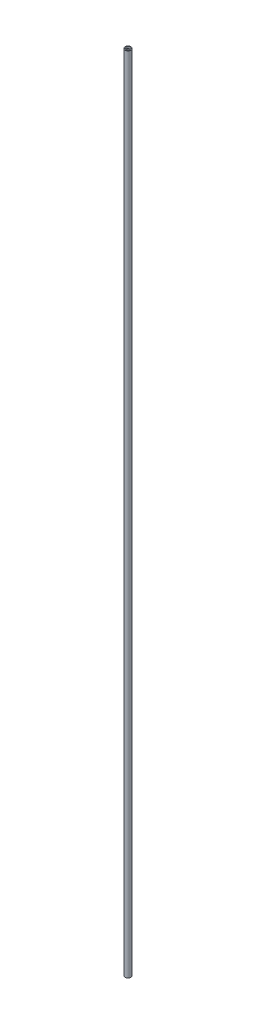
ISO-10303-21;
HEADER;
FILE_DESCRIPTION(('STEP AP214'),'2;1');
FILE_NAME('part.step','',(''),(''),'','','');
FILE_SCHEMA(('AUTOMOTIVE_DESIGN { 1 0 10303 214 1 1 1 1 }'));
ENDSEC;
DATA;
#1=APPLICATION_CONTEXT('core data for automotive mechanical design processes');
#2=APPLICATION_PROTOCOL_DEFINITION('international standard','automotive_design',2000,#1);
#3=PRODUCT_CONTEXT('',#1,'mechanical');
#4=PRODUCT('Part','Part','',(#3));
#5=PRODUCT_RELATED_PRODUCT_CATEGORY('part','',(#4));
#6=PRODUCT_DEFINITION_FORMATION('','',#4);
#7=PRODUCT_DEFINITION_CONTEXT('part definition',#1,'design');
#8=PRODUCT_DEFINITION('design','',#6,#7);
#9=PRODUCT_DEFINITION_SHAPE('','',#8);
#10=(LENGTH_UNIT() NAMED_UNIT(*) SI_UNIT(.MILLI.,.METRE.));
#11=(NAMED_UNIT(*) PLANE_ANGLE_UNIT() SI_UNIT($,.RADIAN.));
#12=(NAMED_UNIT(*) SI_UNIT($,.STERADIAN.) SOLID_ANGLE_UNIT());
#13=UNCERTAINTY_MEASURE_WITH_UNIT(LENGTH_MEASURE(1.E-05),#10,'distance_accuracy_value','');
#14=(GEOMETRIC_REPRESENTATION_CONTEXT(3) GLOBAL_UNCERTAINTY_ASSIGNED_CONTEXT((#13)) GLOBAL_UNIT_ASSIGNED_CONTEXT((#10,
#11,#12)) REPRESENTATION_CONTEXT('',''));
#15=CARTESIAN_POINT('',(0.,0.,0.));
#16=DIRECTION('',(0.,0.,1.));
#17=DIRECTION('',(1.,0.,0.));
#18=AXIS2_PLACEMENT_3D('',#15,#16,#17);
#19=CARTESIAN_POINT('',(0.,855.,0.));
#20=DIRECTION('',(0.,1.,0.));
#21=DIRECTION('',(0.,0.,1.));
#22=AXIS2_PLACEMENT_3D('',#19,#20,#21);
#23=PLANE('',#22);
#24=CARTESIAN_POINT('',(0.,855.,0.));
#25=DIRECTION('',(0.,1.,0.));
#26=DIRECTION('',(0.,0.,1.));
#27=AXIS2_PLACEMENT_3D('',#24,#25,#26);
#28=CIRCLE('',#27,2.16235026918937);
#29=CARTESIAN_POINT('',(0.,855.,2.16235026918937));
#30=VERTEX_POINT('',#29);
#31=EDGE_CURVE('E39',#30,#30,#28,.F.);
#32=ORIENTED_EDGE('',*,*,#31,.T.);
#33=EDGE_LOOP('',(#32));
#34=FACE_BOUND('',#33,.T.);
#35=CARTESIAN_POINT('',(0.,855.,0.));
#36=DIRECTION('',(0.,1.,0.));
#37=DIRECTION('',(0.,0.,1.));
#38=AXIS2_PLACEMENT_3D('',#35,#36,#37);
#39=CIRCLE('',#38,3.175);
#40=CARTESIAN_POINT('',(0.,855.,-3.175));
#41=VERTEX_POINT('',#40);
#42=EDGE_CURVE('E52',#41,#41,#39,.T.);
#43=ORIENTED_EDGE('',*,*,#42,.T.);
#44=EDGE_LOOP('',(#43));
#45=FACE_BOUND('',#44,.T.);
#46=ADVANCED_FACE('F32',(#34,#45),#23,.T.);
#47=CARTESIAN_POINT('',(0.,0.,0.));
#48=DIRECTION('',(0.,1.,0.));
#49=DIRECTION('',(0.,0.,1.));
#50=AXIS2_PLACEMENT_3D('',#47,#48,#49);
#51=PLANE('',#50);
#52=CARTESIAN_POINT('',(0.,0.,0.));
#53=DIRECTION('',(0.,1.,0.));
#54=DIRECTION('',(0.,0.,1.));
#55=AXIS2_PLACEMENT_3D('',#52,#53,#54);
#56=CIRCLE('',#55,2.16235026918954);
#57=CARTESIAN_POINT('',(0.,0.,2.16235026918954));
#58=VERTEX_POINT('',#57);
#59=EDGE_CURVE('E10',#58,#58,#56,.T.);
#60=ORIENTED_EDGE('',*,*,#59,.T.);
#61=EDGE_LOOP('',(#60));
#62=FACE_BOUND('',#61,.T.);
#63=CARTESIAN_POINT('',(0.,0.,0.));
#64=DIRECTION('',(0.,1.,0.));
#65=DIRECTION('',(0.,0.,1.));
#66=AXIS2_PLACEMENT_3D('',#63,#64,#65);
#67=CIRCLE('',#66,3.175);
#68=CARTESIAN_POINT('',(0.,-1.11022302462516E-13,-3.175));
#69=VERTEX_POINT('',#68);
#70=EDGE_CURVE('E53',#69,#69,#67,.T.);
#71=ORIENTED_EDGE('',*,*,#70,.F.);
#72=EDGE_LOOP('',(#71));
#73=FACE_BOUND('',#72,.T.);
#74=ADVANCED_FACE('F64',(#62,#73),#51,.F.);
#75=CARTESIAN_POINT('',(0.,855.,0.));
#76=DIRECTION('',(0.,-1.,0.));
#77=DIRECTION('',(0.,0.,-1.));
#78=AXIS2_PLACEMENT_3D('',#75,#76,#77);
#79=CYLINDRICAL_SURFACE('',#78,3.175);
#80=CARTESIAN_POINT('',(0.,855.,-3.175));
#81=CARTESIAN_POINT('',(0.,846.09375,-3.175));
#82=CARTESIAN_POINT('',(0.,837.1875,-3.175));
#83=CARTESIAN_POINT('',(0.,819.375,-3.175));
#84=CARTESIAN_POINT('',(0.,810.46875,-3.175));
#85=CARTESIAN_POINT('',(0.,792.65625,-3.175));
#86=CARTESIAN_POINT('',(0.,783.75,-3.175));
#87=CARTESIAN_POINT('',(0.,765.9375,-3.175));
#88=CARTESIAN_POINT('',(0.,757.03125,-3.175));
#89=CARTESIAN_POINT('',(0.,739.21875,-3.175));
#90=CARTESIAN_POINT('',(0.,730.3125,-3.175));
#91=CARTESIAN_POINT('',(0.,712.5,-3.175));
#92=CARTESIAN_POINT('',(0.,703.59375,-3.175));
#93=CARTESIAN_POINT('',(0.,685.78125,-3.175));
#94=CARTESIAN_POINT('',(0.,676.875,-3.175));
#95=CARTESIAN_POINT('',(0.,659.0625,-3.175));
#96=CARTESIAN_POINT('',(0.,650.15625,-3.175));
#97=CARTESIAN_POINT('',(0.,632.34375,-3.175));
#98=CARTESIAN_POINT('',(0.,623.4375,-3.175));
#99=CARTESIAN_POINT('',(0.,605.625,-3.175));
#100=CARTESIAN_POINT('',(0.,596.71875,-3.175));
#101=CARTESIAN_POINT('',(0.,578.90625,-3.175));
#102=CARTESIAN_POINT('',(0.,570.,-3.175));
#103=CARTESIAN_POINT('',(0.,552.1875,-3.175));
#104=CARTESIAN_POINT('',(0.,543.28125,-3.175));
#105=CARTESIAN_POINT('',(0.,525.46875,-3.175));
#106=CARTESIAN_POINT('',(0.,516.5625,-3.175));
#107=CARTESIAN_POINT('',(0.,498.75,-3.175));
#108=CARTESIAN_POINT('',(0.,489.84375,-3.175));
#109=CARTESIAN_POINT('',(0.,472.03125,-3.175));
#110=CARTESIAN_POINT('',(0.,463.125,-3.175));
#111=CARTESIAN_POINT('',(0.,445.3125,-3.175));
#112=CARTESIAN_POINT('',(0.,436.40625,-3.175));
#113=CARTESIAN_POINT('',(0.,418.59375,-3.175));
#114=CARTESIAN_POINT('',(0.,409.6875,-3.175));
#115=CARTESIAN_POINT('',(0.,391.875,-3.175));
#116=CARTESIAN_POINT('',(0.,382.96875,-3.175));
#117=CARTESIAN_POINT('',(0.,365.15625,-3.175));
#118=CARTESIAN_POINT('',(0.,356.25,-3.175));
#119=CARTESIAN_POINT('',(0.,338.4375,-3.175));
#120=CARTESIAN_POINT('',(0.,329.53125,-3.175));
#121=CARTESIAN_POINT('',(0.,311.71875,-3.175));
#122=CARTESIAN_POINT('',(0.,302.8125,-3.175));
#123=CARTESIAN_POINT('',(0.,285.,-3.175));
#124=CARTESIAN_POINT('',(0.,276.09375,-3.175));
#125=CARTESIAN_POINT('',(0.,258.28125,-3.175));
#126=CARTESIAN_POINT('',(0.,249.375,-3.175));
#127=CARTESIAN_POINT('',(0.,231.5625,-3.175));
#128=CARTESIAN_POINT('',(0.,222.65625,-3.175));
#129=CARTESIAN_POINT('',(0.,204.84375,-3.175));
#130=CARTESIAN_POINT('',(0.,195.9375,-3.175));
#131=CARTESIAN_POINT('',(0.,178.125,-3.175));
#132=CARTESIAN_POINT('',(0.,169.21875,-3.175));
#133=CARTESIAN_POINT('',(0.,151.40625,-3.175));
#134=CARTESIAN_POINT('',(0.,142.5,-3.175));
#135=CARTESIAN_POINT('',(0.,124.6875,-3.175));
#136=CARTESIAN_POINT('',(0.,115.78125,-3.175));
#137=CARTESIAN_POINT('',(0.,97.9687499999999,-3.175));
#138=CARTESIAN_POINT('',(0.,89.0624999999999,-3.175));
#139=CARTESIAN_POINT('',(0.,71.2499999999999,-3.175));
#140=CARTESIAN_POINT('',(0.,62.3437499999999,-3.175));
#141=CARTESIAN_POINT('',(0.,44.5312499999999,-3.175));
#142=CARTESIAN_POINT('',(0.,35.6249999999999,-3.175));
#143=CARTESIAN_POINT('',(0.,17.8124999999999,-3.175));
#144=CARTESIAN_POINT('',(0.,8.9062499999999,-3.175));
#145=CARTESIAN_POINT('',(0.,-1.11022302462516E-13,-3.175));
#146=B_SPLINE_CURVE_WITH_KNOTS('',3,(#80,#81,#82,#83,#84,#85,#86,#87,#88,#89,#90,#91,#92,#93,
#94,#95,#96,#97,#98,#99,#100,#101,#102,#103,#104,#105,#106,#107,#108,#109,#110,#111,#112,#113,
#114,#115,#116,#117,#118,#119,#120,#121,#122,#123,#124,#125,#126,#127,#128,#129,#130,#131,#132,
#133,#134,#135,#136,#137,#138,#139,#140,#141,#142,#143,#144,#145),.UNSPECIFIED.,.F.,.F.,(4,2,2,
2,2,2,2,2,2,2,2,2,2,2,2,2,2,2,2,2,2,2,2,2,2,2,2,2,2,2,2,2,4),(0.,26.7187499999999,
53.4374999999999,80.1562499999999,106.875,133.59375,160.3125,187.03125,213.75,240.46875,
267.1875,293.90625,320.625,347.34375,374.0625,400.78125,427.5,454.21875,480.9375,507.65625,
534.375,561.09375,587.8125,614.53125,641.25,667.96875,694.6875,721.40625,748.125,774.84375,
801.5625,828.28125,855.),.UNSPECIFIED.);
#147=EDGE_CURVE('BSEAM60',#41,#69,#146,.T.);
#148=ORIENTED_EDGE('',*,*,#42,.F.);
#149=ORIENTED_EDGE('',*,*,#70,.T.);
#150=ORIENTED_EDGE('',*,*,#147,.T.);
#151=ORIENTED_EDGE('',*,*,#147,.F.);
#152=EDGE_LOOP('',(#148,#150,#149,#151));
#153=FACE_BOUND('',#152,.T.);
#154=ADVANCED_FACE('F60',(#153),#79,.T.);
#155=CARTESIAN_POINT('',(0.,855.,0.));
#156=DIRECTION('',(0.,-1.,0.));
#157=DIRECTION('',(0.,0.,-1.));
#158=AXIS2_PLACEMENT_3D('',#155,#156,#157);
#159=CYLINDRICAL_SURFACE('',#158,1.585);
#160=CARTESIAN_POINT('',(0.,854.,0.));
#161=DIRECTION('',(0.,1.,0.));
#162=DIRECTION('',(0.,0.,1.));
#163=AXIS2_PLACEMENT_3D('',#160,#161,#162);
#164=CIRCLE('',#163,1.585);
#165=CARTESIAN_POINT('',(0.,854.,-1.585));
#166=VERTEX_POINT('',#165);
#167=EDGE_CURVE('E43',#166,#166,#164,.T.);
#168=CARTESIAN_POINT('',(0.,1.00000000000022,0.));
#169=DIRECTION('',(0.,1.,0.));
#170=DIRECTION('',(0.,0.,1.));
#171=AXIS2_PLACEMENT_3D('',#168,#169,#170);
#172=CIRCLE('',#171,1.585);
#173=CARTESIAN_POINT('',(0.,1.00000000000022,-1.585));
#174=VERTEX_POINT('',#173);
#175=EDGE_CURVE('E47',#174,#174,#172,.F.);
#176=CARTESIAN_POINT('',(0.,854.,-1.585));
#177=CARTESIAN_POINT('',(0.,845.114583333334,-1.585));
#178=CARTESIAN_POINT('',(0.,836.229166666667,-1.585));
#179=CARTESIAN_POINT('',(0.,818.458333333334,-1.585));
#180=CARTESIAN_POINT('',(0.,809.572916666667,-1.585));
#181=CARTESIAN_POINT('',(0.,791.802083333334,-1.585));
#182=CARTESIAN_POINT('',(0.,782.916666666667,-1.585));
#183=CARTESIAN_POINT('',(0.,765.145833333334,-1.585));
#184=CARTESIAN_POINT('',(0.,756.260416666667,-1.585));
#185=CARTESIAN_POINT('',(0.,738.489583333334,-1.585));
#186=CARTESIAN_POINT('',(0.,729.604166666667,-1.585));
#187=CARTESIAN_POINT('',(0.,711.833333333334,-1.585));
#188=CARTESIAN_POINT('',(0.,702.947916666667,-1.585));
#189=CARTESIAN_POINT('',(0.,685.177083333334,-1.585));
#190=CARTESIAN_POINT('',(0.,676.291666666667,-1.585));
#191=CARTESIAN_POINT('',(0.,658.520833333334,-1.585));
#192=CARTESIAN_POINT('',(0.,649.635416666667,-1.585));
#193=CARTESIAN_POINT('',(0.,631.864583333334,-1.585));
#194=CARTESIAN_POINT('',(0.,622.979166666667,-1.585));
#195=CARTESIAN_POINT('',(0.,605.208333333334,-1.585));
#196=CARTESIAN_POINT('',(0.,596.322916666667,-1.585));
#197=CARTESIAN_POINT('',(0.,578.552083333334,-1.585));
#198=CARTESIAN_POINT('',(0.,569.666666666667,-1.585));
#199=CARTESIAN_POINT('',(0.,551.895833333334,-1.585));
#200=CARTESIAN_POINT('',(0.,543.010416666667,-1.585));
#201=CARTESIAN_POINT('',(0.,525.239583333334,-1.585));
#202=CARTESIAN_POINT('',(0.,516.354166666667,-1.585));
#203=CARTESIAN_POINT('',(0.,498.583333333334,-1.585));
#204=CARTESIAN_POINT('',(0.,489.697916666667,-1.585));
#205=CARTESIAN_POINT('',(0.,471.927083333334,-1.585));
#206=CARTESIAN_POINT('',(0.,463.041666666667,-1.585));
#207=CARTESIAN_POINT('',(0.,445.270833333334,-1.585));
#208=CARTESIAN_POINT('',(0.,436.385416666667,-1.585));
#209=CARTESIAN_POINT('',(0.,418.614583333334,-1.585));
#210=CARTESIAN_POINT('',(0.,409.729166666667,-1.585));
#211=CARTESIAN_POINT('',(0.,391.958333333334,-1.585));
#212=CARTESIAN_POINT('',(0.,383.072916666667,-1.585));
#213=CARTESIAN_POINT('',(0.,365.302083333334,-1.585));
#214=CARTESIAN_POINT('',(0.,356.416666666667,-1.585));
#215=CARTESIAN_POINT('',(0.,338.645833333334,-1.585));
#216=CARTESIAN_POINT('',(0.,329.760416666667,-1.585));
#217=CARTESIAN_POINT('',(0.,311.989583333334,-1.585));
#218=CARTESIAN_POINT('',(0.,303.104166666667,-1.585));
#219=CARTESIAN_POINT('',(0.,285.333333333334,-1.585));
#220=CARTESIAN_POINT('',(0.,276.447916666667,-1.585));
#221=CARTESIAN_POINT('',(0.,258.677083333334,-1.585));
#222=CARTESIAN_POINT('',(0.,249.791666666667,-1.585));
#223=CARTESIAN_POINT('',(0.,232.020833333334,-1.585));
#224=CARTESIAN_POINT('',(0.,223.135416666667,-1.585));
#225=CARTESIAN_POINT('',(0.,205.364583333334,-1.585));
#226=CARTESIAN_POINT('',(0.,196.479166666667,-1.585));
#227=CARTESIAN_POINT('',(0.,178.708333333334,-1.585));
#228=CARTESIAN_POINT('',(0.,169.822916666667,-1.585));
#229=CARTESIAN_POINT('',(0.,152.052083333334,-1.585));
#230=CARTESIAN_POINT('',(0.,143.166666666667,-1.585));
#231=CARTESIAN_POINT('',(0.,125.395833333334,-1.585));
#232=CARTESIAN_POINT('',(0.,116.510416666667,-1.585));
#233=CARTESIAN_POINT('',(0.,98.7395833333336,-1.585));
#234=CARTESIAN_POINT('',(0.,89.854166666667,-1.585));
#235=CARTESIAN_POINT('',(0.,72.0833333333337,-1.585));
#236=CARTESIAN_POINT('',(0.,63.197916666667,-1.585));
#237=CARTESIAN_POINT('',(0.,45.4270833333336,-1.585));
#238=CARTESIAN_POINT('',(0.,36.541666666667,-1.585));
#239=CARTESIAN_POINT('',(0.,18.7708333333336,-1.585));
#240=CARTESIAN_POINT('',(0.,9.8854166666669,-1.585));
#241=CARTESIAN_POINT('',(0.,1.00000000000022,-1.585));
#242=B_SPLINE_CURVE_WITH_KNOTS('',3,(#176,#177,#178,#179,#180,#181,#182,#183,#184,#185,#186,
#187,#188,#189,#190,#191,#192,#193,#194,#195,#196,#197,#198,#199,#200,#201,#202,#203,#204,#205,
#206,#207,#208,#209,#210,#211,#212,#213,#214,#215,#216,#217,#218,#219,#220,#221,#222,#223,#224,
#225,#226,#227,#228,#229,#230,#231,#232,#233,#234,#235,#236,#237,#238,#239,#240,#241),
.UNSPECIFIED.,.F.,.F.,(4,2,2,2,2,2,2,2,2,2,2,2,2,2,2,2,2,2,2,2,2,2,2,2,2,2,2,2,2,2,2,2,4),(0.,
26.65625,53.3125000000001,79.96875,106.625,133.28125,159.9375,186.59375,213.25,239.90625,
266.5625,293.21875,319.875,346.53125,373.1875,399.84375,426.5,453.15625,479.8125,506.46875,
533.125,559.78125,586.4375,613.09375,639.75,666.40625,693.0625,719.71875,746.375,773.03125,
799.6875,826.34375,853.),.UNSPECIFIED.);
#243=EDGE_CURVE('BSEAM63',#166,#174,#242,.T.);
#244=ORIENTED_EDGE('',*,*,#167,.T.);
#245=ORIENTED_EDGE('',*,*,#175,.T.);
#246=ORIENTED_EDGE('',*,*,#243,.T.);
#247=ORIENTED_EDGE('',*,*,#243,.F.);
#248=EDGE_LOOP('',(#244,#246,#245,#247));
#249=FACE_BOUND('',#248,.T.);
#250=ADVANCED_FACE('F63',(#249),#159,.F.);
#251=CARTESIAN_POINT('',(0.,854.,0.));
#252=DIRECTION('',(0.,1.,0.));
#253=DIRECTION('',(0.,0.,1.));
#254=AXIS2_PLACEMENT_3D('',#251,#252,#253);
#255=CONICAL_SURFACE('',#254,1.585,0.523598775598301);
#256=ORIENTED_EDGE('',*,*,#31,.F.);
#257=EDGE_LOOP('',(#256));
#258=FACE_BOUND('',#257,.T.);
#259=ORIENTED_EDGE('',*,*,#167,.F.);
#260=EDGE_LOOP('',(#259));
#261=FACE_BOUND('',#260,.T.);
#262=ADVANCED_FACE('F75',(#258,#261),#255,.F.);
#263=CARTESIAN_POINT('',(0.,0.,0.));
#264=DIRECTION('',(0.,-1.,0.));
#265=DIRECTION('',(0.,0.,-1.));
#266=AXIS2_PLACEMENT_3D('',#263,#264,#265);
#267=CONICAL_SURFACE('',#266,2.16235026918954,0.523598775598137);
#268=ORIENTED_EDGE('',*,*,#175,.F.);
#269=EDGE_LOOP('',(#268));
#270=FACE_BOUND('',#269,.T.);
#271=ORIENTED_EDGE('',*,*,#59,.F.);
#272=EDGE_LOOP('',(#271));
#273=FACE_BOUND('',#272,.T.);
#274=ADVANCED_FACE('F34',(#270,#273),#267,.F.);
#275=CLOSED_SHELL('',(#46,#74,#154,#250,#262,#274));
#276=MANIFOLD_SOLID_BREP('B2',#275);
#277=ADVANCED_BREP_SHAPE_REPRESENTATION('',(#18,#276),#14);
#278=SHAPE_DEFINITION_REPRESENTATION(#9,#277);
ENDSEC;
END-ISO-10303-21;
